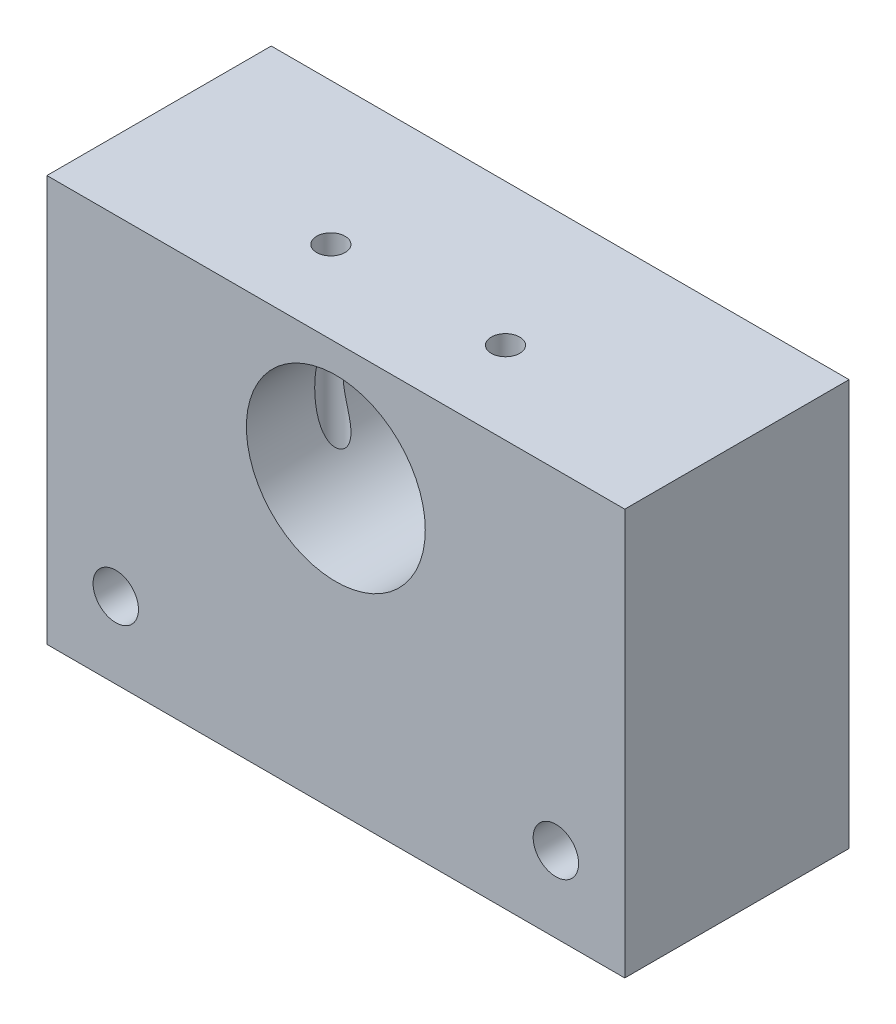
ISO-10303-21;
HEADER;
FILE_DESCRIPTION(('STEP AP214'),'2;1');
FILE_NAME('part.step','',(''),(''),'','','');
FILE_SCHEMA(('AUTOMOTIVE_DESIGN { 1 0 10303 214 1 1 1 1 }'));
ENDSEC;
DATA;
#1=APPLICATION_CONTEXT('core data for automotive mechanical design processes');
#2=APPLICATION_PROTOCOL_DEFINITION('international standard','automotive_design',2000,#1);
#3=PRODUCT_CONTEXT('',#1,'mechanical');
#4=PRODUCT('Part','Part','',(#3));
#5=PRODUCT_RELATED_PRODUCT_CATEGORY('part','',(#4));
#6=PRODUCT_DEFINITION_FORMATION('','',#4);
#7=PRODUCT_DEFINITION_CONTEXT('part definition',#1,'design');
#8=PRODUCT_DEFINITION('design','',#6,#7);
#9=PRODUCT_DEFINITION_SHAPE('','',#8);
#10=(LENGTH_UNIT() NAMED_UNIT(*) SI_UNIT(.MILLI.,.METRE.));
#11=(NAMED_UNIT(*) PLANE_ANGLE_UNIT() SI_UNIT($,.RADIAN.));
#12=(NAMED_UNIT(*) SI_UNIT($,.STERADIAN.) SOLID_ANGLE_UNIT());
#13=UNCERTAINTY_MEASURE_WITH_UNIT(LENGTH_MEASURE(1.E-05),#10,'distance_accuracy_value','');
#14=(GEOMETRIC_REPRESENTATION_CONTEXT(3) GLOBAL_UNCERTAINTY_ASSIGNED_CONTEXT((#13)) GLOBAL_UNIT_ASSIGNED_CONTEXT((#10,
#11,#12)) REPRESENTATION_CONTEXT('',''));
#15=CARTESIAN_POINT('',(0.,0.,0.));
#16=DIRECTION('',(0.,0.,1.));
#17=DIRECTION('',(1.,0.,0.));
#18=AXIS2_PLACEMENT_3D('',#15,#16,#17);
#19=CARTESIAN_POINT('',(0.,0.,15.8));
#20=DIRECTION('',(1.,0.,0.));
#21=DIRECTION('',(0.,0.,-1.));
#22=AXIS2_PLACEMENT_3D('',#19,#20,#21);
#23=PLANE('',#22);
#24=DIRECTION('',(0.,-1.,0.));
#25=VECTOR('',#24,1.);
#26=CARTESIAN_POINT('',(0.,0.,0.));
#27=LINE('',#26,#25);
#28=CARTESIAN_POINT('',(0.,28.6,0.));
#29=VERTEX_POINT('',#28);
#30=CARTESIAN_POINT('',(0.,0.,0.));
#31=VERTEX_POINT('',#30);
#32=EDGE_CURVE('E105',#29,#31,#27,.T.);
#33=ORIENTED_EDGE('',*,*,#32,.T.);
#34=DIRECTION('',(0.,0.,-1.));
#35=VECTOR('',#34,1.);
#36=CARTESIAN_POINT('',(0.,0.,15.8));
#37=LINE('',#36,#35);
#38=CARTESIAN_POINT('',(0.,0.,15.8));
#39=VERTEX_POINT('',#38);
#40=EDGE_CURVE('E11',#39,#31,#37,.T.);
#41=ORIENTED_EDGE('',*,*,#40,.F.);
#42=DIRECTION('',(0.,-1.,0.));
#43=VECTOR('',#42,1.);
#44=CARTESIAN_POINT('',(0.,0.,15.8));
#45=LINE('',#44,#43);
#46=CARTESIAN_POINT('',(0.,28.6,15.8));
#47=VERTEX_POINT('',#46);
#48=EDGE_CURVE('E92',#47,#39,#45,.T.);
#49=ORIENTED_EDGE('',*,*,#48,.F.);
#50=DIRECTION('',(0.,0.,-1.));
#51=VECTOR('',#50,1.);
#52=CARTESIAN_POINT('',(0.,28.6,15.8));
#53=LINE('',#52,#51);
#54=EDGE_CURVE('E101',#47,#29,#53,.T.);
#55=ORIENTED_EDGE('',*,*,#54,.T.);
#56=EDGE_LOOP('',(#33,#41,#49,#55));
#57=FACE_BOUND('',#56,.T.);
#58=ADVANCED_FACE('F35',(#57),#23,.F.);
#59=CARTESIAN_POINT('',(0.,0.,15.8));
#60=DIRECTION('',(0.,1.,0.));
#61=DIRECTION('',(0.,0.,1.));
#62=AXIS2_PLACEMENT_3D('',#59,#60,#61);
#63=PLANE('',#62);
#64=CARTESIAN_POINT('',(26.5,0.,10.));
#65=DIRECTION('',(0.,-1.,0.));
#66=DIRECTION('',(0.,0.,-1.));
#67=AXIS2_PLACEMENT_3D('',#64,#65,#66);
#68=CIRCLE('',#67,0.999999999999998);
#69=CARTESIAN_POINT('',(26.5,0.,9.));
#70=VERTEX_POINT('',#69);
#71=EDGE_CURVE('E267',#70,#70,#68,.T.);
#72=ORIENTED_EDGE('',*,*,#71,.F.);
#73=EDGE_LOOP('',(#72));
#74=FACE_BOUND('',#73,.T.);
#75=CARTESIAN_POINT('',(14.2,0.,10.));
#76=DIRECTION('',(0.,-1.,0.));
#77=DIRECTION('',(0.,0.,-1.));
#78=AXIS2_PLACEMENT_3D('',#75,#76,#77);
#79=CIRCLE('',#78,0.999999999999999);
#80=CARTESIAN_POINT('',(14.2,0.,9.));
#81=VERTEX_POINT('',#80);
#82=EDGE_CURVE('E262',#81,#81,#79,.T.);
#83=ORIENTED_EDGE('',*,*,#82,.F.);
#84=EDGE_LOOP('',(#83));
#85=FACE_BOUND('',#84,.T.);
#86=DIRECTION('',(1.,0.,0.));
#87=VECTOR('',#86,1.);
#88=CARTESIAN_POINT('',(0.,0.,0.));
#89=LINE('',#88,#87);
#90=CARTESIAN_POINT('',(40.7,0.,0.));
#91=VERTEX_POINT('',#90);
#92=EDGE_CURVE('E96',#31,#91,#89,.T.);
#93=ORIENTED_EDGE('',*,*,#92,.T.);
#94=DIRECTION('',(0.,0.,-1.));
#95=VECTOR('',#94,1.);
#96=CARTESIAN_POINT('',(40.7,0.,15.8));
#97=LINE('',#96,#95);
#98=CARTESIAN_POINT('',(40.7,0.,15.8));
#99=VERTEX_POINT('',#98);
#100=EDGE_CURVE('E48',#99,#91,#97,.T.);
#101=ORIENTED_EDGE('',*,*,#100,.F.);
#102=DIRECTION('',(1.,0.,0.));
#103=VECTOR('',#102,1.);
#104=CARTESIAN_POINT('',(0.,0.,15.8));
#105=LINE('',#104,#103);
#106=EDGE_CURVE('E87',#39,#99,#105,.T.);
#107=ORIENTED_EDGE('',*,*,#106,.F.);
#108=ORIENTED_EDGE('',*,*,#40,.T.);
#109=EDGE_LOOP('',(#93,#101,#107,#108));
#110=FACE_BOUND('',#109,.T.);
#111=ADVANCED_FACE('F95',(#74,#85,#110),#63,.F.);
#112=CARTESIAN_POINT('',(40.7,0.,15.8));
#113=DIRECTION('',(-1.,0.,0.));
#114=DIRECTION('',(0.,0.,1.));
#115=AXIS2_PLACEMENT_3D('',#112,#113,#114);
#116=PLANE('',#115);
#117=DIRECTION('',(0.,1.,0.));
#118=VECTOR('',#117,1.);
#119=CARTESIAN_POINT('',(40.7,0.,0.));
#120=LINE('',#119,#118);
#121=CARTESIAN_POINT('',(40.7,28.6,0.));
#122=VERTEX_POINT('',#121);
#123=EDGE_CURVE('E74',#91,#122,#120,.T.);
#124=ORIENTED_EDGE('',*,*,#123,.T.);
#125=DIRECTION('',(0.,0.,-1.));
#126=VECTOR('',#125,1.);
#127=CARTESIAN_POINT('',(40.7,28.6,15.8));
#128=LINE('',#127,#126);
#129=CARTESIAN_POINT('',(40.7,28.6,15.8));
#130=VERTEX_POINT('',#129);
#131=EDGE_CURVE('E97',#130,#122,#128,.T.);
#132=ORIENTED_EDGE('',*,*,#131,.F.);
#133=DIRECTION('',(0.,1.,0.));
#134=VECTOR('',#133,1.);
#135=CARTESIAN_POINT('',(40.7,0.,15.8));
#136=LINE('',#135,#134);
#137=EDGE_CURVE('E90',#99,#130,#136,.T.);
#138=ORIENTED_EDGE('',*,*,#137,.F.);
#139=ORIENTED_EDGE('',*,*,#100,.T.);
#140=EDGE_LOOP('',(#124,#132,#138,#139));
#141=FACE_BOUND('',#140,.T.);
#142=ADVANCED_FACE('F99',(#141),#116,.F.);
#143=CARTESIAN_POINT('',(0.,28.6,15.8));
#144=DIRECTION('',(0.,-1.,0.));
#145=DIRECTION('',(0.,0.,-1.));
#146=AXIS2_PLACEMENT_3D('',#143,#144,#145);
#147=PLANE('',#146);
#148=CARTESIAN_POINT('',(26.5,28.6,10.));
#149=DIRECTION('',(0.,-1.,0.));
#150=DIRECTION('',(0.,0.,-1.));
#151=AXIS2_PLACEMENT_3D('',#148,#149,#150);
#152=CIRCLE('',#151,0.999999999999998);
#153=CARTESIAN_POINT('',(26.5,28.6,9.));
#154=VERTEX_POINT('',#153);
#155=EDGE_CURVE('E269',#154,#154,#152,.T.);
#156=ORIENTED_EDGE('',*,*,#155,.T.);
#157=EDGE_LOOP('',(#156));
#158=FACE_BOUND('',#157,.T.);
#159=CARTESIAN_POINT('',(14.2,28.6,10.));
#160=DIRECTION('',(0.,-1.,0.));
#161=DIRECTION('',(0.,0.,-1.));
#162=AXIS2_PLACEMENT_3D('',#159,#160,#161);
#163=CIRCLE('',#162,0.999999999999999);
#164=CARTESIAN_POINT('',(14.2,28.6,9.));
#165=VERTEX_POINT('',#164);
#166=EDGE_CURVE('E119',#165,#165,#163,.T.);
#167=ORIENTED_EDGE('',*,*,#166,.T.);
#168=EDGE_LOOP('',(#167));
#169=FACE_BOUND('',#168,.T.);
#170=DIRECTION('',(-1.,0.,0.));
#171=VECTOR('',#170,1.);
#172=CARTESIAN_POINT('',(0.,28.6,0.));
#173=LINE('',#172,#171);
#174=EDGE_CURVE('E80',#122,#29,#173,.T.);
#175=ORIENTED_EDGE('',*,*,#174,.T.);
#176=ORIENTED_EDGE('',*,*,#54,.F.);
#177=DIRECTION('',(-1.,0.,0.));
#178=VECTOR('',#177,1.);
#179=CARTESIAN_POINT('',(0.,28.6,15.8));
#180=LINE('',#179,#178);
#181=EDGE_CURVE('E57',#130,#47,#180,.T.);
#182=ORIENTED_EDGE('',*,*,#181,.F.);
#183=ORIENTED_EDGE('',*,*,#131,.T.);
#184=EDGE_LOOP('',(#175,#176,#182,#183));
#185=FACE_BOUND('',#184,.T.);
#186=ADVANCED_FACE('F155',(#158,#169,#185),#147,.F.);
#187=CARTESIAN_POINT('',(0.,0.,15.8));
#188=DIRECTION('',(0.,0.,-1.));
#189=DIRECTION('',(-1.,0.,0.));
#190=AXIS2_PLACEMENT_3D('',#187,#188,#189);
#191=PLANE('',#190);
#192=CARTESIAN_POINT('',(20.35,20.3,15.8));
#193=DIRECTION('',(0.,0.,1.));
#194=DIRECTION('',(1.,0.,0.));
#195=AXIS2_PLACEMENT_3D('',#192,#193,#194);
#196=CIRCLE('',#195,6.3);
#197=CARTESIAN_POINT('',(26.65,20.3,15.8));
#198=VERTEX_POINT('',#197);
#199=EDGE_CURVE('E118',#198,#198,#196,.T.);
#200=ORIENTED_EDGE('',*,*,#199,.F.);
#201=EDGE_LOOP('',(#200));
#202=FACE_BOUND('',#201,.T.);
#203=CARTESIAN_POINT('',(4.85,5.35,15.8));
#204=DIRECTION('',(0.,0.,1.));
#205=DIRECTION('',(1.,0.,0.));
#206=AXIS2_PLACEMENT_3D('',#203,#204,#205);
#207=CIRCLE('',#206,1.6);
#208=CARTESIAN_POINT('',(6.45,5.35,15.8));
#209=VERTEX_POINT('',#208);
#210=EDGE_CURVE('E240',#209,#209,#207,.T.);
#211=ORIENTED_EDGE('',*,*,#210,.F.);
#212=EDGE_LOOP('',(#211));
#213=FACE_BOUND('',#212,.T.);
#214=CARTESIAN_POINT('',(35.85,5.35,15.8));
#215=DIRECTION('',(0.,0.,1.));
#216=DIRECTION('',(1.,0.,0.));
#217=AXIS2_PLACEMENT_3D('',#214,#215,#216);
#218=CIRCLE('',#217,1.6);
#219=CARTESIAN_POINT('',(37.45,5.35,15.8));
#220=VERTEX_POINT('',#219);
#221=EDGE_CURVE('E247',#220,#220,#218,.T.);
#222=ORIENTED_EDGE('',*,*,#221,.F.);
#223=EDGE_LOOP('',(#222));
#224=FACE_BOUND('',#223,.T.);
#225=ORIENTED_EDGE('',*,*,#48,.T.);
#226=ORIENTED_EDGE('',*,*,#106,.T.);
#227=ORIENTED_EDGE('',*,*,#137,.T.);
#228=ORIENTED_EDGE('',*,*,#181,.T.);
#229=EDGE_LOOP('',(#225,#226,#227,#228));
#230=FACE_BOUND('',#229,.T.);
#231=ADVANCED_FACE('F88',(#202,#213,#224,#230),#191,.F.);
#232=CARTESIAN_POINT('',(0.,0.,0.));
#233=DIRECTION('',(0.,0.,-1.));
#234=DIRECTION('',(-1.,0.,0.));
#235=AXIS2_PLACEMENT_3D('',#232,#233,#234);
#236=PLANE('',#235);
#237=CARTESIAN_POINT('',(20.35,20.3,0.));
#238=DIRECTION('',(0.,0.,1.));
#239=DIRECTION('',(1.,0.,0.));
#240=AXIS2_PLACEMENT_3D('',#237,#238,#239);
#241=CIRCLE('',#240,6.3);
#242=CARTESIAN_POINT('',(26.65,20.3,0.));
#243=VERTEX_POINT('',#242);
#244=EDGE_CURVE('E236',#243,#243,#241,.T.);
#245=ORIENTED_EDGE('',*,*,#244,.T.);
#246=EDGE_LOOP('',(#245));
#247=FACE_BOUND('',#246,.T.);
#248=CARTESIAN_POINT('',(4.85,5.35,0.));
#249=DIRECTION('',(0.,0.,1.));
#250=DIRECTION('',(1.,0.,0.));
#251=AXIS2_PLACEMENT_3D('',#248,#249,#250);
#252=CIRCLE('',#251,1.6);
#253=CARTESIAN_POINT('',(6.45,5.35,0.));
#254=VERTEX_POINT('',#253);
#255=EDGE_CURVE('E244',#254,#254,#252,.T.);
#256=ORIENTED_EDGE('',*,*,#255,.T.);
#257=EDGE_LOOP('',(#256));
#258=FACE_BOUND('',#257,.T.);
#259=CARTESIAN_POINT('',(35.85,5.35,0.));
#260=DIRECTION('',(0.,0.,1.));
#261=DIRECTION('',(1.,0.,0.));
#262=AXIS2_PLACEMENT_3D('',#259,#260,#261);
#263=CIRCLE('',#262,1.6);
#264=CARTESIAN_POINT('',(37.45,5.35,0.));
#265=VERTEX_POINT('',#264);
#266=EDGE_CURVE('E108',#265,#265,#263,.T.);
#267=ORIENTED_EDGE('',*,*,#266,.T.);
#268=EDGE_LOOP('',(#267));
#269=FACE_BOUND('',#268,.T.);
#270=ORIENTED_EDGE('',*,*,#32,.F.);
#271=ORIENTED_EDGE('',*,*,#174,.F.);
#272=ORIENTED_EDGE('',*,*,#123,.F.);
#273=ORIENTED_EDGE('',*,*,#92,.F.);
#274=EDGE_LOOP('',(#270,#271,#272,#273));
#275=FACE_BOUND('',#274,.T.);
#276=ADVANCED_FACE('F143',(#247,#258,#269,#275),#236,.T.);
#277=CARTESIAN_POINT('',(35.85,5.35,0.));
#278=DIRECTION('',(0.,0.,1.));
#279=DIRECTION('',(1.,0.,0.));
#280=AXIS2_PLACEMENT_3D('',#277,#278,#279);
#281=CYLINDRICAL_SURFACE('',#280,1.6);
#282=ORIENTED_EDGE('',*,*,#266,.F.);
#283=EDGE_LOOP('',(#282));
#284=FACE_BOUND('',#283,.T.);
#285=ORIENTED_EDGE('',*,*,#221,.T.);
#286=EDGE_LOOP('',(#285));
#287=FACE_BOUND('',#286,.T.);
#288=ADVANCED_FACE('F145',(#284,#287),#281,.F.);
#289=CARTESIAN_POINT('',(4.85,5.35,0.));
#290=DIRECTION('',(0.,0.,1.));
#291=DIRECTION('',(1.,0.,0.));
#292=AXIS2_PLACEMENT_3D('',#289,#290,#291);
#293=CYLINDRICAL_SURFACE('',#292,1.6);
#294=ORIENTED_EDGE('',*,*,#255,.F.);
#295=EDGE_LOOP('',(#294));
#296=FACE_BOUND('',#295,.T.);
#297=ORIENTED_EDGE('',*,*,#210,.T.);
#298=EDGE_LOOP('',(#297));
#299=FACE_BOUND('',#298,.T.);
#300=ADVANCED_FACE('F152',(#296,#299),#293,.F.);
#301=CARTESIAN_POINT('',(20.35,20.3,0.));
#302=DIRECTION('',(0.,0.,1.));
#303=DIRECTION('',(1.,0.,0.));
#304=AXIS2_PLACEMENT_3D('',#301,#302,#303);
#305=CYLINDRICAL_SURFACE('',#304,6.3);
#306=CARTESIAN_POINT('',(26.65,20.3,9.01131400333574));
#307=CARTESIAN_POINT('',(26.6499988359164,20.4694103893535,9.01130435753158));
#308=CARTESIAN_POINT('',(26.6431603813977,20.6388483774412,9.01020037150479));
#309=CARTESIAN_POINT('',(26.6158484875347,20.9766791991546,9.00664194448781));
#310=CARTESIAN_POINT('',(26.5953671452742,21.1450713698719,9.00418672090955));
#311=CARTESIAN_POINT('',(26.5408274634162,21.4800369462497,9.00045590316118));
#312=CARTESIAN_POINT('',(26.5067425394802,21.6466061306628,8.99918263508795));
#313=CARTESIAN_POINT('',(26.4456394441233,21.8938597911457,9.00127556466818));
#314=CARTESIAN_POINT('',(26.423617237728,21.9758200996312,9.00263933651033));
#315=CARTESIAN_POINT('',(26.3762989345602,22.1387251946105,9.00739421632932));
#316=CARTESIAN_POINT('',(26.3510034627113,22.2196701717212,9.01078493777224));
#317=CARTESIAN_POINT('',(26.2972969079354,22.3800946106777,9.02038104745651));
#318=CARTESIAN_POINT('',(26.2688951648624,22.4595776697425,9.02657816486556));
#319=CARTESIAN_POINT('',(26.2090657539523,22.6169875982798,9.04275480093751));
#320=CARTESIAN_POINT('',(26.1776392967922,22.694915075436,9.05273281091237));
#321=CARTESIAN_POINT('',(26.1121743483649,22.8483854293383,9.07760535742502));
#322=CARTESIAN_POINT('',(26.0781507457313,22.9239388409719,9.09247327982461));
#323=CARTESIAN_POINT('',(26.0078044213923,23.0723584983597,9.12861636919852));
#324=CARTESIAN_POINT('',(25.9714843192745,23.1452276609744,9.14988433627003));
#325=CARTESIAN_POINT('',(25.9066313695289,23.2694201010821,9.19436664222703));
#326=CARTESIAN_POINT('',(25.8784300981809,23.3215634803543,9.21575498729807));
#327=CARTESIAN_POINT('',(25.8217012218697,23.4231180350341,9.26426428149261));
#328=CARTESIAN_POINT('',(25.7931731679596,23.4725247175977,9.29139432425041));
#329=CARTESIAN_POINT('',(25.7364889280002,23.5678494281169,9.35283774126462));
#330=CARTESIAN_POINT('',(25.7083392586622,23.6137278893358,9.38721984910687));
#331=CARTESIAN_POINT('',(25.6543215284183,23.6995176046506,9.46425049837404));
#332=CARTESIAN_POINT('',(25.628446808083,23.7394465305628,9.50687365839787));
#333=CARTESIAN_POINT('',(25.5903974374035,23.7969907531742,9.58324270603796));
#334=CARTESIAN_POINT('',(25.5767539342635,23.8173183282168,9.61420376699739));
#335=CARTESIAN_POINT('',(25.5520937290508,23.8536884189421,9.67954632307737));
#336=CARTESIAN_POINT('',(25.5410757954733,23.8697329439851,9.71392620385735));
#337=CARTESIAN_POINT('',(25.5224513729557,23.8966681572569,9.78600073776969));
#338=CARTESIAN_POINT('',(25.5148816545338,23.907503359786,9.82372621723527));
#339=CARTESIAN_POINT('',(25.5041461630919,23.9228261546986,9.90104800698296));
#340=CARTESIAN_POINT('',(25.5009750771472,23.9273214049565,9.94064200045832));
#341=CARTESIAN_POINT('',(25.4995178903087,23.9293889709117,10.0146346200149));
#342=CARTESIAN_POINT('',(25.5006209825118,23.9278268906862,10.0490003453691));
#343=CARTESIAN_POINT('',(25.5062681986237,23.9197958523416,10.1168588232221));
#344=CARTESIAN_POINT('',(25.5108126278357,23.9133264588631,10.1503514979943));
#345=CARTESIAN_POINT('',(25.5227218230876,23.8962550892289,10.2143600912257));
#346=CARTESIAN_POINT('',(25.5299774136594,23.885812832482,10.2449400707395));
#347=CARTESIAN_POINT('',(25.5468140036847,23.8613684217909,10.3039394684875));
#348=CARTESIAN_POINT('',(25.556395759778,23.8473651094593,10.3323581797605));
#349=CARTESIAN_POINT('',(25.5829127044755,23.8081951189508,10.4011704689935));
#350=CARTESIAN_POINT('',(25.6010594138498,23.7810378881328,10.4399650645894));
#351=CARTESIAN_POINT('',(25.6399803267748,23.7216051739531,10.5119061681067));
#352=CARTESIAN_POINT('',(25.6607612560322,23.6893165335255,10.5450376897328));
#353=CARTESIAN_POINT('',(25.7160606304424,23.6014220647294,10.6236190742902));
#354=CARTESIAN_POINT('',(25.7516207454823,23.5430662182357,10.665231639471));
#355=CARTESIAN_POINT('',(25.8233004601119,23.4205875246314,10.7380325689298));
#356=CARTESIAN_POINT('',(25.8594210827161,23.3564527579062,10.7691987316652));
#357=CARTESIAN_POINT('',(25.9281362872204,23.2290379375923,10.821396732327));
#358=CARTESIAN_POINT('',(25.9607994512753,23.1660188643869,10.8429898623555));
#359=CARTESIAN_POINT('',(26.0245940268744,23.037541972914,10.8805453437115));
#360=CARTESIAN_POINT('',(26.0557240645624,22.9720820564453,10.8965027210221));
#361=CARTESIAN_POINT('',(26.1160783860339,22.8392276270047,10.9239611813133));
#362=CARTESIAN_POINT('',(26.1452985773089,22.7718293782941,10.9354529398096));
#363=CARTESIAN_POINT('',(26.2015305803889,22.635599307999,10.9548824405732));
#364=CARTESIAN_POINT('',(26.2285415552765,22.5667669554095,10.9628188410149));
#365=CARTESIAN_POINT('',(26.280737400457,22.426515752474,10.9760450457751));
#366=CARTESIAN_POINT('',(26.3058722730172,22.3550729142869,10.9812760357928));
#367=CARTESIAN_POINT('',(26.3535852765832,22.2112068439716,10.9895184331025));
#368=CARTESIAN_POINT('',(26.3761629042444,22.138783421964,10.9925294040669));
#369=CARTESIAN_POINT('',(26.4399942552174,21.9201895388673,10.9991216640882));
#370=CARTESIAN_POINT('',(26.4773144352764,21.7727814320409,11.0002557120725));
#371=CARTESIAN_POINT('',(26.5412225641349,21.4755475229395,10.9996583781405));
#372=CARTESIAN_POINT('',(26.5677993352835,21.3257193704317,10.9979240213799));
#373=CARTESIAN_POINT('',(26.61003761859,21.0245905904564,10.9941537930436));
#374=CARTESIAN_POINT('',(26.6257032501319,20.873290540587,10.9921180356108));
#375=CARTESIAN_POINT('',(26.6469294892246,20.5568168166091,10.9892131338693));
#376=CARTESIAN_POINT('',(26.651499395518,20.3915745655686,10.9884600628305));
#377=CARTESIAN_POINT('',(26.6476404713463,20.0612024115712,10.9890422353148));
#378=CARTESIAN_POINT('',(26.6392079524451,19.8960725537922,10.9903780714058));
#379=CARTESIAN_POINT('',(26.609427104784,19.5673719753451,10.9941069040705));
#380=CARTESIAN_POINT('',(26.5881079374523,19.4037985789273,10.9964975104965));
#381=CARTESIAN_POINT('',(26.5327207689305,19.0788884425476,10.9998492599181));
#382=CARTESIAN_POINT('',(26.4986590548667,18.9175506401955,11.0008111066971));
#383=CARTESIAN_POINT('',(26.4216526713141,18.6125616914734,10.9976038410072));
#384=CARTESIAN_POINT('',(26.3797974267473,18.4686363325757,10.9938933557209));
#385=CARTESIAN_POINT('',(26.3094514534057,18.2553542860349,10.9819632684556));
#386=CARTESIAN_POINT('',(26.2846944092526,18.1845781922791,10.9769120122713));
#387=CARTESIAN_POINT('',(26.2327627525691,18.0441855717214,10.9640033408827));
#388=CARTESIAN_POINT('',(26.2055887553054,17.9745687551373,10.9561466383146));
#389=CARTESIAN_POINT('',(26.1485527408709,17.8357561888413,10.9366996295025));
#390=CARTESIAN_POINT('',(26.1186573534368,17.7665813196732,10.9250566397423));
#391=CARTESIAN_POINT('',(26.0567577926018,17.6300690647244,10.8970464918786));
#392=CARTESIAN_POINT('',(26.0247521988267,17.5627329606273,10.8806761262162));
#393=CARTESIAN_POINT('',(25.9593171598931,17.431040236754,10.8420789273978));
#394=CARTESIAN_POINT('',(25.9258987460623,17.3666666158105,10.8198922470482));
#395=CARTESIAN_POINT('',(25.8582334822711,17.2415045438379,10.7680830532238));
#396=CARTESIAN_POINT('',(25.8239884387932,17.1807091248931,10.7384756247336));
#397=CARTESIAN_POINT('',(25.7680920249081,17.0850075603263,10.6821096703119));
#398=CARTESIAN_POINT('',(25.7462939539016,17.048584736583,10.6580839512312));
#399=CARTESIAN_POINT('',(25.7034582715259,16.9785295130618,10.6055345989092));
#400=CARTESIAN_POINT('',(25.6824213428674,16.9448995850042,10.5770070449325));
#401=CARTESIAN_POINT('',(25.6417803286125,16.8811548176928,10.5146431229762));
#402=CARTESIAN_POINT('',(25.6221911005268,16.8510749246635,10.4807606053212));
#403=CARTESIAN_POINT('',(25.5859071993631,16.7962370969119,10.4075458338537));
#404=CARTESIAN_POINT('',(25.5692069330553,16.7714688556527,10.3682243820902));
#405=CARTESIAN_POINT('',(25.5442467446725,16.7348699723953,10.2959224268219));
#406=CARTESIAN_POINT('',(25.534928359689,16.7213542909946,10.2641650998425));
#407=CARTESIAN_POINT('',(25.5192950461613,16.6988088262917,10.198385925316));
#408=CARTESIAN_POINT('',(25.5129777306455,16.6897754776046,10.1643659020949));
#409=CARTESIAN_POINT('',(25.5038682356209,16.6767820957042,10.0946709786861));
#410=CARTESIAN_POINT('',(25.5010978362123,16.6728534058565,10.0589872352851));
#411=CARTESIAN_POINT('',(25.4994389817784,16.6704985207628,9.98734832653519));
#412=CARTESIAN_POINT('',(25.5005496961124,16.6720711481181,9.95139322090712));
#413=CARTESIAN_POINT('',(25.5062656826798,16.6802011065038,9.88360839831682));
#414=CARTESIAN_POINT('',(25.5105532948388,16.6863054127732,9.85169500746536));
#415=CARTESIAN_POINT('',(25.5219046270278,16.70257031336,9.78944823580626));
#416=CARTESIAN_POINT('',(25.5289692852167,16.712732278479,9.75911539287513));
#417=CARTESIAN_POINT('',(25.5481273608161,16.7405281634389,9.69084496670203));
#418=CARTESIAN_POINT('',(25.5611112499931,16.759521868008,9.65371221952637));
#419=CARTESIAN_POINT('',(25.5899965323737,16.8024140419475,9.58366231877747));
#420=CARTESIAN_POINT('',(25.6059035204944,16.8263219278231,9.55075345861586));
#421=CARTESIAN_POINT('',(25.6475124191968,16.8899575272371,9.4747124449273));
#422=CARTESIAN_POINT('',(25.674312885043,16.9318506442539,9.43400950098724));
#423=CARTESIAN_POINT('',(25.7297168355992,17.0210636922726,9.36063623688374));
#424=CARTESIAN_POINT('',(25.7583239309603,17.0683946562824,9.32798268589442));
#425=CARTESIAN_POINT('',(25.8120190480215,17.1601297932882,9.27340622693208));
#426=CARTESIAN_POINT('',(25.8370601430653,17.2040649834437,9.25062950405107));
#427=CARTESIAN_POINT('',(25.886877641756,17.2940668010021,9.20934931942741));
#428=CARTESIAN_POINT('',(25.9116538294622,17.3401350250456,9.19084912295392));
#429=CARTESIAN_POINT('',(25.9605853449201,17.4339683168724,9.15743797058718));
#430=CARTESIAN_POINT('',(25.9847395161577,17.4817362003071,9.14253332221278));
#431=CARTESIAN_POINT('',(26.0321410839601,17.5785694501132,9.11577892045081));
#432=CARTESIAN_POINT('',(26.0553881185965,17.6276353215155,9.1039303760187));
#433=CARTESIAN_POINT('',(26.123990626365,17.7774688142087,9.07199479696751));
#434=CARTESIAN_POINT('',(26.1676722415238,17.8798509585366,9.05585579487898));
#435=CARTESIAN_POINT('',(26.2498070600713,18.0875818381542,9.03085655839041));
#436=CARTESIAN_POINT('',(26.2882548236534,18.1929335246641,9.02200384951762));
#437=CARTESIAN_POINT('',(26.3595858990685,18.4059288770524,9.00924430175426));
#438=CARTESIAN_POINT('',(26.3924619729721,18.5135753227724,9.00534385408806));
#439=CARTESIAN_POINT('',(26.4524149345024,18.7305395623369,9.0006810141913));
#440=CARTESIAN_POINT('',(26.4794908456277,18.8398576342985,8.99991914997208));
#441=CARTESIAN_POINT('',(26.5279325514079,19.0606368382596,9.00009461879846));
#442=CARTESIAN_POINT('',(26.5492522752093,19.1721080269433,9.00104521974639));
#443=CARTESIAN_POINT('',(26.585841665056,19.3960359995926,9.00352258953681));
#444=CARTESIAN_POINT('',(26.6011110253135,19.5084928330796,9.00504938749289));
#445=CARTESIAN_POINT('',(26.6255426609621,19.7339551636356,9.00783508887978));
#446=CARTESIAN_POINT('',(26.6347112763812,19.8469599677945,9.00909426949501));
#447=CARTESIAN_POINT('',(26.6469404936515,20.0733057178928,9.01083697385353));
#448=CARTESIAN_POINT('',(26.650000778894,20.1866466809512,9.01132045739042));
#449=CARTESIAN_POINT('',(26.65,20.3,9.01131400333574));
#450=B_SPLINE_CURVE_WITH_KNOTS('',3,(#306,#307,#308,#309,#310,#311,#312,#313,#314,#315,#316,
#317,#318,#319,#320,#321,#322,#323,#324,#325,#326,#327,#328,#329,#330,#331,#332,#333,#334,#335,
#336,#337,#338,#339,#340,#341,#342,#343,#344,#345,#346,#347,#348,#349,#350,#351,#352,#353,#354,
#355,#356,#357,#358,#359,#360,#361,#362,#363,#364,#365,#366,#367,#368,#369,#370,#371,#372,#373,
#374,#375,#376,#377,#378,#379,#380,#381,#382,#383,#384,#385,#386,#387,#388,#389,#390,#391,#392,
#393,#394,#395,#396,#397,#398,#399,#400,#401,#402,#403,#404,#405,#406,#407,#408,#409,#410,#411,
#412,#413,#414,#415,#416,#417,#418,#419,#420,#421,#422,#423,#424,#425,#426,#427,#428,#429,#430,
#431,#432,#433,#434,#435,#436,#437,#438,#439,#440,#441,#442,#443,#444,#445,#446,#447,#448,#449),
.UNSPECIFIED.,.T.,.F.,(4,2,2,2,2,2,2,2,2,2,2,2,2,2,2,2,2,2,2,2,2,2,2,2,2,2,2,2,2,2,2,2,2,2,2,2,
2,2,2,2,2,2,2,2,2,2,2,2,2,2,2,2,2,2,2,2,2,2,2,2,2,2,2,2,2,2,2,2,2,2,2,4),(0.,0.508136424929908,
1.01656745433674,1.5259969713993,1.78055886753676,2.03507223487506,2.28884034948472,
2.54250730955845,2.79481588261724,3.04684166877124,3.23565788886643,3.42477542228045,
3.6157731203336,3.80619167958556,3.92422361528354,4.04220007948886,4.1614067325442,
4.28046927510524,4.38318816338589,4.485916165585,4.58488876709981,4.68389360501255,
4.83516767191352,4.98683606028318,5.22551481142301,5.46469765243889,5.68694606989158,
5.90939015258984,6.13229624780422,6.35528639914699,6.5829395709196,6.81063747425156,
7.26630826678497,7.72245193534583,8.17842329826654,8.67381492385315,9.16934710448869,
9.66376211262858,10.1579334992459,10.6071677017837,10.8325414549897,11.0578579997023,
11.2864543701249,11.5152062107557,11.7424186524292,11.9691729078316,12.1152687335296,
12.2614925063597,12.4090530789481,12.5563246864894,12.6631616847018,12.7699135647144,
12.8773178670503,12.9846991839911,13.0825862058372,13.1805063249386,13.3108278640551,
13.4414014917826,13.6331208724933,13.8252363463503,13.9913871440918,14.1576643874873,
14.3242312367693,14.4908638770476,14.8277132351719,15.1649100675339,15.5025416340895,
15.8402299988849,16.1805459804231,16.5208791594686,16.8608581020993,17.2008546661543),.UNSPECIFIED.);
#451=CARTESIAN_POINT('',(26.65,20.3,9.01131400333574));
#452=VERTEX_POINT('',#451);
#453=EDGE_CURVE('E38',#452,#452,#450,.T.);
#454=ORIENTED_EDGE('',*,*,#453,.T.);
#455=EDGE_LOOP('',(#454));
#456=FACE_BOUND('',#455,.T.);
#457=CARTESIAN_POINT('',(14.2,21.6665650368716,9.));
#458=CARTESIAN_POINT('',(14.1633065847992,21.5014278999208,8.9999911680235));
#459=CARTESIAN_POINT('',(14.1332614269803,21.334781447797,9.00195369431184));
#460=CARTESIAN_POINT('',(14.0866698895661,20.9995442651446,9.00616898273455));
#461=CARTESIAN_POINT('',(14.0701313046012,20.8309524687883,9.00842191159292));
#462=CARTESIAN_POINT('',(14.0506397629429,20.4922348734509,9.01116620328289));
#463=CARTESIAN_POINT('',(14.0477453046316,20.3221055969488,9.01164997899371));
#464=CARTESIAN_POINT('',(14.055723889481,19.9822397740605,9.01045480592273));
#465=CARTESIAN_POINT('',(14.0665920906477,19.8125031105885,9.00877661776184));
#466=CARTESIAN_POINT('',(14.1020715088487,19.4738727175791,9.00464757258462));
#467=CARTESIAN_POINT('',(14.1267323303791,19.3049842633351,9.00219394065452));
#468=CARTESIAN_POINT('',(14.1897286813099,18.9695131861229,8.99955150706351));
#469=CARTESIAN_POINT('',(14.2280793396188,18.8029333268509,8.99936521911481));
#470=CARTESIAN_POINT('',(14.295496383214,18.5563822248391,9.00432208721743));
#471=CARTESIAN_POINT('',(14.3195406318297,18.4749628355355,9.00683358583406));
#472=CARTESIAN_POINT('',(14.3708608568794,18.3132733207412,9.0143619837469));
#473=CARTESIAN_POINT('',(14.3981360593279,18.2330029251487,9.01937828393185));
#474=CARTESIAN_POINT('',(14.4557457288613,18.0740396629988,9.0328046488981));
#475=CARTESIAN_POINT('',(14.4860735977916,17.9953438167728,9.04120750718749));
#476=CARTESIAN_POINT('',(14.5496266421301,17.839773066063,9.06251055122769));
#477=CARTESIAN_POINT('',(14.5828500066805,17.7628970611608,9.07540794099769));
#478=CARTESIAN_POINT('',(14.6396307791475,17.6383132944199,9.10148798479022));
#479=CARTESIAN_POINT('',(14.6624490136015,17.5899092163659,9.11295510326611));
#480=CARTESIAN_POINT('',(14.7089972757547,17.4943069930655,9.13881948002178));
#481=CARTESIAN_POINT('',(14.7327275535449,17.4471091845826,9.15321754671282));
#482=CARTESIAN_POINT('',(14.7807919416726,17.3543863578615,9.18543530742818));
#483=CARTESIAN_POINT('',(14.805124096135,17.3088568756786,9.20324493311956));
#484=CARTESIAN_POINT('',(14.8540956933413,17.2198028811714,9.2429321933771));
#485=CARTESIAN_POINT('',(14.8787348910269,17.1762768856323,9.26480675613982));
#486=CARTESIAN_POINT('',(14.9289122200625,17.0899522777828,9.31444269848601));
#487=CARTESIAN_POINT('',(14.9544416024777,17.0472720830739,9.34242260154655));
#488=CARTESIAN_POINT('',(15.0043813413966,16.9658382517915,9.40455264447431));
#489=CARTESIAN_POINT('',(15.0287921056256,16.9270831782159,9.43870051338825));
#490=CARTESIAN_POINT('',(15.070671026867,16.8619931407072,9.50683471070233));
#491=CARTESIAN_POINT('',(15.0885773711188,16.8346970975795,9.53962075545594));
#492=CARTESIAN_POINT('',(15.1216264813689,16.7850323639383,9.60998990104336));
#493=CARTESIAN_POINT('',(15.1367740597847,16.7626550787044,9.64756445024848));
#494=CARTESIAN_POINT('',(15.159965522776,16.7287445724627,9.71802886917835));
#495=CARTESIAN_POINT('',(15.1688419413123,16.7159010102777,9.75000932505116));
#496=CARTESIAN_POINT('',(15.1835299192118,16.6947602240268,9.81611958498701));
#497=CARTESIAN_POINT('',(15.1893436351448,16.6864598007965,9.85024785768044));
#498=CARTESIAN_POINT('',(15.19741393023,16.6749608834461,9.91998182430379));
#499=CARTESIAN_POINT('',(15.1996504464646,16.6717911639722,9.9555947096233));
#500=CARTESIAN_POINT('',(15.2002731254377,16.6709073006625,10.0269208172718));
#501=CARTESIAN_POINT('',(15.1986598940878,16.673192298309,10.0626340229277));
#502=CARTESIAN_POINT('',(15.1920499865069,16.6826004989566,10.1299348463803));
#503=CARTESIAN_POINT('',(15.1873536295668,16.6892944151652,10.1616145386086));
#504=CARTESIAN_POINT('',(15.1752550182635,16.7066553329199,10.2233105145541));
#505=CARTESIAN_POINT('',(15.1678518381908,16.7173236937145,10.2533262251552));
#506=CARTESIAN_POINT('',(15.1477638971561,16.7465295739305,10.3215934636103));
#507=CARTESIAN_POINT('',(15.1341371514358,16.7665169527017,10.358946460142));
#508=CARTESIAN_POINT('',(15.1039964891546,16.8114212208162,10.429257033945));
#509=CARTESIAN_POINT('',(15.0874768367395,16.8363479166566,10.4622056452619));
#510=CARTESIAN_POINT('',(15.044182125669,16.9028655063473,10.5386194972628));
#511=CARTESIAN_POINT('',(15.0163034314888,16.9466954490173,10.579493161834));
#512=CARTESIAN_POINT('',(14.9588692595922,17.0398274558931,10.6529154649707));
#513=CARTESIAN_POINT('',(14.9293102926675,17.0891411266536,10.6854459448365));
#514=CARTESIAN_POINT('',(14.8737238694041,17.185023788239,10.7398695013284));
#515=CARTESIAN_POINT('',(14.8477228381368,17.231150478661,10.7625877407236));
#516=CARTESIAN_POINT('',(14.7961111628913,17.3255728101763,10.8035785911307));
#517=CARTESIAN_POINT('',(14.7705008374087,17.3738701061011,10.8218477397178));
#518=CARTESIAN_POINT('',(14.7200388355312,17.4721748032096,10.8546734271421));
#519=CARTESIAN_POINT('',(14.695188346404,17.5221846452685,10.8692243935276));
#520=CARTESIAN_POINT('',(14.6465275106753,17.6235160108247,10.8951937096708));
#521=CARTESIAN_POINT('',(14.6227175705974,17.6748380347731,10.9066108441355));
#522=CARTESIAN_POINT('',(14.5523238727786,17.8321516465172,10.9373009577463));
#523=CARTESIAN_POINT('',(14.507648283796,17.9398007881196,10.952490327775));
#524=CARTESIAN_POINT('',(14.4241191286795,18.1581217085267,10.9755198901987));
#525=CARTESIAN_POINT('',(14.3852714125285,18.2687963943802,10.9833527390941));
#526=CARTESIAN_POINT('',(14.3136765560566,18.4926165986085,10.9941785800106));
#527=CARTESIAN_POINT('',(14.2809446526081,18.605767523747,10.9971596229517));
#528=CARTESIAN_POINT('',(14.2218781334931,18.8337154284204,11.0001954979004));
#529=CARTESIAN_POINT('',(14.1955421509392,18.9485120506858,11.0002509556905));
#530=CARTESIAN_POINT('',(14.1377976846732,19.2371203057151,10.9986742438638));
#531=CARTESIAN_POINT('',(14.1104332780444,19.4117499091965,10.996184696843));
#532=CARTESIAN_POINT('',(14.070464268609,19.7627418408852,10.9917776050148));
#533=CARTESIAN_POINT('',(14.0578646244822,19.9391047311682,10.9898602525374));
#534=CARTESIAN_POINT('',(14.0475312292116,20.2921861559121,10.9883228520734));
#535=CARTESIAN_POINT('',(14.0497895400303,20.4689044500493,10.9887015773717));
#536=CARTESIAN_POINT('',(14.0691378934161,20.8214672464555,10.991449480369));
#537=CARTESIAN_POINT('',(14.0862236866303,20.9973119845539,10.9938180877888));
#538=CARTESIAN_POINT('',(14.1286652142264,21.3009652885211,10.9976097392944));
#539=CARTESIAN_POINT('',(14.1506673487383,21.4292526072532,10.9991176879814));
#540=CARTESIAN_POINT('',(14.2025838850666,21.6842698020334,11.0003358766949));
#541=CARTESIAN_POINT('',(14.2324998668908,21.81099936178,11.0000457574755));
#542=CARTESIAN_POINT('',(14.3000707306284,22.0621736774551,10.9955556651695));
#543=CARTESIAN_POINT('',(14.3377172277304,22.186620751068,10.991359911007));
#544=CARTESIAN_POINT('',(14.4204999795347,22.432561230503,10.9762987015796));
#545=CARTESIAN_POINT('',(14.4656296707945,22.5540571186533,10.9654390687967));
#546=CARTESIAN_POINT('',(14.5385220402501,22.7332919285099,10.9413034725528));
#547=CARTESIAN_POINT('',(14.5637203815132,22.7926072341199,10.9319340302673));
#548=CARTESIAN_POINT('',(14.615682930755,22.9099266425879,10.9099482881945));
#549=CARTESIAN_POINT('',(14.6424465730332,22.9679312087687,10.8973331558668));
#550=CARTESIAN_POINT('',(14.6972366993944,23.0821333713254,10.8681682897971));
#551=CARTESIAN_POINT('',(14.7252593041282,23.1383357118232,10.8516300499533));
#552=CARTESIAN_POINT('',(14.7822528287624,23.2485646118323,10.8137278318965));
#553=CARTESIAN_POINT('',(14.8112229417377,23.3025929396098,10.7923678729699));
#554=CARTESIAN_POINT('',(14.8681803401383,23.4053081626745,10.7448797621118));
#555=CARTESIAN_POINT('',(14.8961505401839,23.4541266384579,10.719020093218));
#556=CARTESIAN_POINT('',(14.9516190658031,23.5481460420567,10.6608216257609));
#557=CARTESIAN_POINT('',(14.9791173672844,23.5933467856015,10.6284824974574));
#558=CARTESIAN_POINT('',(15.028153867526,23.6719071612233,10.5617812446387));
#559=CARTESIAN_POINT('',(15.0499552837045,23.706016258506,10.5285094056513));
#560=CARTESIAN_POINT('',(15.0909769359719,23.7690173877625,10.4559473162566));
#561=CARTESIAN_POINT('',(15.1102024833032,23.7979201984724,10.4166698188622));
#562=CARTESIAN_POINT('',(15.1394755408263,23.8413156806615,10.3441599878245));
#563=CARTESIAN_POINT('',(15.1505754207766,23.8575655456635,10.3124112627776));
#564=CARTESIAN_POINT('',(15.1698471302732,23.8855690590246,10.2461379559982));
#565=CARTESIAN_POINT('',(15.1780210027233,23.8973258447878,10.2116153316705));
#566=CARTESIAN_POINT('',(15.1907858813688,23.9156103717539,10.1402362031293));
#567=CARTESIAN_POINT('',(15.1953473401485,23.92209500105,10.1033630643374));
#568=CARTESIAN_POINT('',(15.2002825010344,23.9291087354005,10.0287790584711));
#569=CARTESIAN_POINT('',(15.2006586992784,23.9296413902823,9.99106870417187));
#570=CARTESIAN_POINT('',(15.1974005484769,23.9250135069068,9.92073687348903));
#571=CARTESIAN_POINT('',(15.1942396863707,23.9205251291448,9.88804538828992));
#572=CARTESIAN_POINT('',(15.1849234127279,23.9072217997577,9.82400769402151));
#573=CARTESIAN_POINT('',(15.1787674655907,23.8984060742857,9.7926617266579));
#574=CARTESIAN_POINT('',(15.163690295664,23.8766422738926,9.7310412799974));
#575=CARTESIAN_POINT('',(15.1546909454531,23.8635770955243,9.70082803438194));
#576=CARTESIAN_POINT('',(15.1345661036872,23.8340585116688,9.64288863976106));
#577=CARTESIAN_POINT('',(15.1234396379435,23.8176035534415,9.61516363891911));
#578=CARTESIAN_POINT('',(15.092018191966,23.7705687542646,9.54551929966158));
#579=CARTESIAN_POINT('',(15.07038983158,23.7376576082556,9.50577510411779));
#580=CARTESIAN_POINT('',(15.024771583355,23.6665615703286,9.43289185274524));
#581=CARTESIAN_POINT('',(15.0007751955641,23.6283620399016,9.39977177741614));
#582=CARTESIAN_POINT('',(14.9561963989322,23.5555130512593,9.34488352876188));
#583=CARTESIAN_POINT('',(14.9357835998112,23.5214752020174,9.3221458786594));
#584=CARTESIAN_POINT('',(14.8947245829532,23.4514478041376,9.28012512844644));
#585=CARTESIAN_POINT('',(14.8740782162532,23.4154569470735,9.26084438247384));
#586=CARTESIAN_POINT('',(14.812272474358,23.3051050020719,9.20747029843842));
#587=CARTESIAN_POINT('',(14.7712977004541,23.2284474424078,9.17790365325324));
#588=CARTESIAN_POINT('',(14.6928678804195,23.0738354752868,9.12871081500888));
#589=CARTESIAN_POINT('',(14.6553417416024,22.9960040468077,9.10879296346002));
#590=CARTESIAN_POINT('',(14.5830371897763,22.8376602988072,9.07540948037798));
#591=CARTESIAN_POINT('',(14.5482615388092,22.7571453969974,9.06195026759745));
#592=CARTESIAN_POINT('',(14.4818824412695,22.5941134353845,9.03991418332807));
#593=CARTESIAN_POINT('',(14.4502817711294,22.511594700238,9.03134155493234));
#594=CARTESIAN_POINT('',(14.3905157398897,22.3450843251932,9.0178387312492));
#595=CARTESIAN_POINT('',(14.3623489250891,22.2610933259139,9.01290699011354));
#596=CARTESIAN_POINT('',(14.3097467010518,22.0925071809156,9.00568845611786));
#597=CARTESIAN_POINT('',(14.2852860458733,22.0079206521178,9.00338299908933));
#598=CARTESIAN_POINT('',(14.2399539863389,21.8378796698966,9.00054211553203));
#599=CARTESIAN_POINT('',(14.2190783577446,21.7524263653535,9.00000459209388));
#600=CARTESIAN_POINT('',(14.2,21.6665650368716,9.));
#601=B_SPLINE_CURVE_WITH_KNOTS('',3,(#457,#458,#459,#460,#461,#462,#463,#464,#465,#466,#467,
#468,#469,#470,#471,#472,#473,#474,#475,#476,#477,#478,#479,#480,#481,#482,#483,#484,#485,#486,
#487,#488,#489,#490,#491,#492,#493,#494,#495,#496,#497,#498,#499,#500,#501,#502,#503,#504,#505,
#506,#507,#508,#509,#510,#511,#512,#513,#514,#515,#516,#517,#518,#519,#520,#521,#522,#523,#524,
#525,#526,#527,#528,#529,#530,#531,#532,#533,#534,#535,#536,#537,#538,#539,#540,#541,#542,#543,
#544,#545,#546,#547,#548,#549,#550,#551,#552,#553,#554,#555,#556,#557,#558,#559,#560,#561,#562,
#563,#564,#565,#566,#567,#568,#569,#570,#571,#572,#573,#574,#575,#576,#577,#578,#579,#580,#581,
#582,#583,#584,#585,#586,#587,#588,#589,#590,#591,#592,#593,#594,#595,#596,#597,#598,#599,#600),
.UNSPECIFIED.,.T.,.F.,(4,2,2,2,2,2,2,2,2,2,2,2,2,2,2,2,2,2,2,2,2,2,2,2,2,2,2,2,2,2,2,2,2,2,2,2,
2,2,2,2,2,2,2,2,2,2,2,2,2,2,2,2,2,2,2,2,2,2,2,2,2,2,2,2,2,2,2,2,2,2,2,4),(0.,0.507420676290081,
1.01513397805617,1.52502210257149,2.03473088751204,2.54628471380058,3.05840562745383,
3.3131209780262,3.56777543363973,3.82189082970875,4.07584842575448,4.23995081861673,
4.40409853551794,4.56776907550815,4.73131643175446,4.90213655015117,5.07289390284935,
5.21123084240377,5.34932410472918,5.45566472507611,5.5619303663671,5.6687899403341,
5.77563269678692,5.87336254215092,5.97112584156622,6.10388855237421,6.23691753942621,
6.43410303864471,6.63171413251152,6.80431985589836,6.97705948037225,7.15005649165314,
7.32312049631828,7.67513108572704,8.02749269032076,8.3807207888751,8.73387333164547,
9.26354121353991,9.79338693110593,10.3229495953544,10.8523605443153,11.242634659008,
11.6329867512096,12.0229176680641,12.4125083717224,12.6077899583581,12.803001401079,
12.9976478284754,13.192132597851,13.3775572312069,13.5629913032338,13.7196865794746,
13.8760536195709,13.987701750147,14.0992717765797,14.2117452172556,14.3241515738686,
14.4231368749616,14.5221398837584,14.6241423229528,14.7261915902215,14.8930864675801,
15.0604529157394,15.1974818336501,15.3346037161738,15.6091848011802,15.8748480421012,
16.1407747616163,16.4069320388419,16.6729762458925,16.937117729324,17.200945806823),.UNSPECIFIED.);
#602=CARTESIAN_POINT('',(14.2,21.6665650368716,9.));
#603=VERTEX_POINT('',#602);
#604=EDGE_CURVE('E113',#603,#603,#601,.T.);
#605=ORIENTED_EDGE('',*,*,#604,.T.);
#606=EDGE_LOOP('',(#605));
#607=FACE_BOUND('',#606,.T.);
#608=ORIENTED_EDGE('',*,*,#244,.F.);
#609=EDGE_LOOP('',(#608));
#610=FACE_BOUND('',#609,.T.);
#611=ORIENTED_EDGE('',*,*,#199,.T.);
#612=EDGE_LOOP('',(#611));
#613=FACE_BOUND('',#612,.T.);
#614=ADVANCED_FACE('F120',(#456,#607,#610,#613),#305,.F.);
#615=CARTESIAN_POINT('',(14.2,28.6,10.));
#616=DIRECTION('',(0.,-1.,0.));
#617=DIRECTION('',(0.,0.,-1.));
#618=AXIS2_PLACEMENT_3D('',#615,#616,#617);
#619=CYLINDRICAL_SURFACE('',#618,0.999999999999999);
#620=ORIENTED_EDGE('',*,*,#82,.T.);
#621=EDGE_LOOP('',(#620));
#622=FACE_BOUND('',#621,.T.);
#623=ORIENTED_EDGE('',*,*,#166,.F.);
#624=EDGE_LOOP('',(#623));
#625=FACE_BOUND('',#624,.T.);
#626=ORIENTED_EDGE('',*,*,#604,.F.);
#627=EDGE_LOOP('',(#626));
#628=FACE_BOUND('',#627,.T.);
#629=ADVANCED_FACE('F123',(#622,#625,#628),#619,.F.);
#630=CARTESIAN_POINT('',(26.5,28.6,10.));
#631=DIRECTION('',(0.,-1.,0.));
#632=DIRECTION('',(0.,0.,-1.));
#633=AXIS2_PLACEMENT_3D('',#630,#631,#632);
#634=CYLINDRICAL_SURFACE('',#633,0.999999999999998);
#635=ORIENTED_EDGE('',*,*,#71,.T.);
#636=EDGE_LOOP('',(#635));
#637=FACE_BOUND('',#636,.T.);
#638=ORIENTED_EDGE('',*,*,#155,.F.);
#639=EDGE_LOOP('',(#638));
#640=FACE_BOUND('',#639,.T.);
#641=ORIENTED_EDGE('',*,*,#453,.F.);
#642=EDGE_LOOP('',(#641));
#643=FACE_BOUND('',#642,.T.);
#644=ADVANCED_FACE('F126',(#637,#640,#643),#634,.F.);
#645=CLOSED_SHELL('',(#58,#111,#142,#186,#231,#276,#288,#300,#614,#629,#644));
#646=MANIFOLD_SOLID_BREP('B2',#645);
#647=ADVANCED_BREP_SHAPE_REPRESENTATION('',(#18,#646),#14);
#648=SHAPE_DEFINITION_REPRESENTATION(#9,#647);
ENDSEC;
END-ISO-10303-21;
